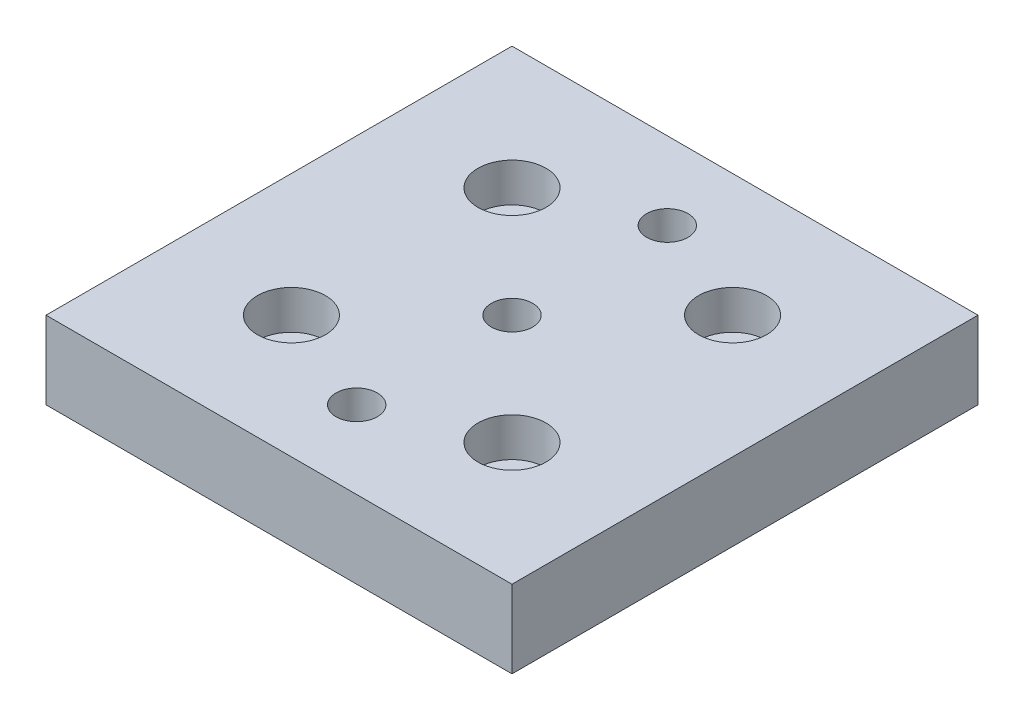
ISO-10303-21;
HEADER;
FILE_DESCRIPTION(('STEP AP214'),'2;1');
FILE_NAME('part.step','',(''),(''),'','','');
FILE_SCHEMA(('AUTOMOTIVE_DESIGN { 1 0 10303 214 1 1 1 1 }'));
ENDSEC;
DATA;
#1=APPLICATION_CONTEXT('core data for automotive mechanical design processes');
#2=APPLICATION_PROTOCOL_DEFINITION('international standard','automotive_design',2000,#1);
#3=PRODUCT_CONTEXT('',#1,'mechanical');
#4=PRODUCT('Part','Part','',(#3));
#5=PRODUCT_RELATED_PRODUCT_CATEGORY('part','',(#4));
#6=PRODUCT_DEFINITION_FORMATION('','',#4);
#7=PRODUCT_DEFINITION_CONTEXT('part definition',#1,'design');
#8=PRODUCT_DEFINITION('design','',#6,#7);
#9=PRODUCT_DEFINITION_SHAPE('','',#8);
#10=(LENGTH_UNIT() NAMED_UNIT(*) SI_UNIT(.MILLI.,.METRE.));
#11=(NAMED_UNIT(*) PLANE_ANGLE_UNIT() SI_UNIT($,.RADIAN.));
#12=(NAMED_UNIT(*) SI_UNIT($,.STERADIAN.) SOLID_ANGLE_UNIT());
#13=UNCERTAINTY_MEASURE_WITH_UNIT(LENGTH_MEASURE(1.E-05),#10,'distance_accuracy_value','');
#14=(GEOMETRIC_REPRESENTATION_CONTEXT(3) GLOBAL_UNCERTAINTY_ASSIGNED_CONTEXT((#13)) GLOBAL_UNIT_ASSIGNED_CONTEXT((#10,
#11,#12)) REPRESENTATION_CONTEXT('',''));
#15=CARTESIAN_POINT('',(0.,0.,0.));
#16=DIRECTION('',(0.,0.,1.));
#17=DIRECTION('',(1.,0.,0.));
#18=AXIS2_PLACEMENT_3D('',#15,#16,#17);
#19=CARTESIAN_POINT('',(38.1,12.7,38.1));
#20=DIRECTION('',(-1.,0.,0.));
#21=DIRECTION('',(0.,0.,1.));
#22=AXIS2_PLACEMENT_3D('',#19,#20,#21);
#23=PLANE('',#22);
#24=DIRECTION('',(0.,0.,-1.));
#25=VECTOR('',#24,1.);
#26=CARTESIAN_POINT('',(38.1,0.,38.1));
#27=LINE('',#26,#25);
#28=CARTESIAN_POINT('',(38.1,0.,38.1));
#29=VERTEX_POINT('',#28);
#30=CARTESIAN_POINT('',(38.1,0.,-38.1));
#31=VERTEX_POINT('',#30);
#32=EDGE_CURVE('E95',#29,#31,#27,.T.);
#33=ORIENTED_EDGE('',*,*,#32,.T.);
#34=DIRECTION('',(0.,-1.,0.));
#35=VECTOR('',#34,1.);
#36=CARTESIAN_POINT('',(38.1,12.7,-38.1));
#37=LINE('',#36,#35);
#38=CARTESIAN_POINT('',(38.1,12.7,-38.1));
#39=VERTEX_POINT('',#38);
#40=EDGE_CURVE('E11',#39,#31,#37,.T.);
#41=ORIENTED_EDGE('',*,*,#40,.F.);
#42=DIRECTION('',(0.,0.,-1.));
#43=VECTOR('',#42,1.);
#44=CARTESIAN_POINT('',(38.1,12.7,38.1));
#45=LINE('',#44,#43);
#46=CARTESIAN_POINT('',(38.1,12.7,38.1));
#47=VERTEX_POINT('',#46);
#48=EDGE_CURVE('E83',#47,#39,#45,.T.);
#49=ORIENTED_EDGE('',*,*,#48,.F.);
#50=DIRECTION('',(0.,-1.,0.));
#51=VECTOR('',#50,1.);
#52=CARTESIAN_POINT('',(38.1,12.7,38.1));
#53=LINE('',#52,#51);
#54=EDGE_CURVE('E91',#47,#29,#53,.T.);
#55=ORIENTED_EDGE('',*,*,#54,.T.);
#56=EDGE_LOOP('',(#33,#41,#49,#55));
#57=FACE_BOUND('',#56,.T.);
#58=ADVANCED_FACE('F32',(#57),#23,.F.);
#59=CARTESIAN_POINT('',(-38.1,12.7,-38.1));
#60=DIRECTION('',(0.,0.,1.));
#61=DIRECTION('',(1.,0.,0.));
#62=AXIS2_PLACEMENT_3D('',#59,#60,#61);
#63=PLANE('',#62);
#64=DIRECTION('',(-1.,0.,0.));
#65=VECTOR('',#64,1.);
#66=CARTESIAN_POINT('',(-38.1,0.,-38.1));
#67=LINE('',#66,#65);
#68=CARTESIAN_POINT('',(-38.1,0.,-38.1));
#69=VERTEX_POINT('',#68);
#70=EDGE_CURVE('E87',#31,#69,#67,.T.);
#71=ORIENTED_EDGE('',*,*,#70,.T.);
#72=DIRECTION('',(0.,-1.,0.));
#73=VECTOR('',#72,1.);
#74=CARTESIAN_POINT('',(-38.1,12.7,-38.1));
#75=LINE('',#74,#73);
#76=CARTESIAN_POINT('',(-38.1,12.7,-38.1));
#77=VERTEX_POINT('',#76);
#78=EDGE_CURVE('E40',#77,#69,#75,.T.);
#79=ORIENTED_EDGE('',*,*,#78,.F.);
#80=DIRECTION('',(-1.,0.,0.));
#81=VECTOR('',#80,1.);
#82=CARTESIAN_POINT('',(-38.1,12.7,-38.1));
#83=LINE('',#82,#81);
#84=EDGE_CURVE('E78',#39,#77,#83,.T.);
#85=ORIENTED_EDGE('',*,*,#84,.F.);
#86=ORIENTED_EDGE('',*,*,#40,.T.);
#87=EDGE_LOOP('',(#71,#79,#85,#86));
#88=FACE_BOUND('',#87,.T.);
#89=ADVANCED_FACE('F86',(#88),#63,.F.);
#90=CARTESIAN_POINT('',(-38.1,12.7,38.1));
#91=DIRECTION('',(1.,0.,0.));
#92=DIRECTION('',(0.,0.,-1.));
#93=AXIS2_PLACEMENT_3D('',#90,#91,#92);
#94=PLANE('',#93);
#95=DIRECTION('',(0.,0.,1.));
#96=VECTOR('',#95,1.);
#97=CARTESIAN_POINT('',(-38.1,0.,38.1));
#98=LINE('',#97,#96);
#99=CARTESIAN_POINT('',(-38.1,0.,38.1));
#100=VERTEX_POINT('',#99);
#101=EDGE_CURVE('E65',#69,#100,#98,.T.);
#102=ORIENTED_EDGE('',*,*,#101,.T.);
#103=DIRECTION('',(0.,-1.,0.));
#104=VECTOR('',#103,1.);
#105=CARTESIAN_POINT('',(-38.1,12.7,38.1));
#106=LINE('',#105,#104);
#107=CARTESIAN_POINT('',(-38.1,12.7,38.1));
#108=VERTEX_POINT('',#107);
#109=EDGE_CURVE('E88',#108,#100,#106,.T.);
#110=ORIENTED_EDGE('',*,*,#109,.F.);
#111=DIRECTION('',(0.,0.,1.));
#112=VECTOR('',#111,1.);
#113=CARTESIAN_POINT('',(-38.1,12.7,38.1));
#114=LINE('',#113,#112);
#115=EDGE_CURVE('E81',#77,#108,#114,.T.);
#116=ORIENTED_EDGE('',*,*,#115,.F.);
#117=ORIENTED_EDGE('',*,*,#78,.T.);
#118=EDGE_LOOP('',(#102,#110,#116,#117));
#119=FACE_BOUND('',#118,.T.);
#120=ADVANCED_FACE('F89',(#119),#94,.F.);
#121=CARTESIAN_POINT('',(-38.1,12.7,38.1));
#122=DIRECTION('',(0.,0.,-1.));
#123=DIRECTION('',(-1.,0.,0.));
#124=AXIS2_PLACEMENT_3D('',#121,#122,#123);
#125=PLANE('',#124);
#126=DIRECTION('',(1.,0.,0.));
#127=VECTOR('',#126,1.);
#128=CARTESIAN_POINT('',(-38.1,0.,38.1));
#129=LINE('',#128,#127);
#130=EDGE_CURVE('E71',#100,#29,#129,.T.);
#131=ORIENTED_EDGE('',*,*,#130,.T.);
#132=ORIENTED_EDGE('',*,*,#54,.F.);
#133=DIRECTION('',(1.,0.,0.));
#134=VECTOR('',#133,1.);
#135=CARTESIAN_POINT('',(-38.1,12.7,38.1));
#136=LINE('',#135,#134);
#137=EDGE_CURVE('E48',#108,#47,#136,.T.);
#138=ORIENTED_EDGE('',*,*,#137,.F.);
#139=ORIENTED_EDGE('',*,*,#109,.T.);
#140=EDGE_LOOP('',(#131,#132,#138,#139));
#141=FACE_BOUND('',#140,.T.);
#142=ADVANCED_FACE('F103',(#141),#125,.F.);
#143=CARTESIAN_POINT('',(0.,12.7,0.));
#144=DIRECTION('',(0.,-1.,0.));
#145=DIRECTION('',(0.,0.,-1.));
#146=AXIS2_PLACEMENT_3D('',#143,#144,#145);
#147=PLANE('',#146);
#148=CARTESIAN_POINT('',(0.,12.7,-25.4));
#149=DIRECTION('',(0.,-1.,0.));
#150=DIRECTION('',(0.,0.,-1.));
#151=AXIS2_PLACEMENT_3D('',#148,#149,#150);
#152=CIRCLE('',#151,3.3782);
#153=CARTESIAN_POINT('',(0.,12.7,-28.7782));
#154=VERTEX_POINT('',#153);
#155=EDGE_CURVE('E180',#154,#154,#152,.T.);
#156=ORIENTED_EDGE('',*,*,#155,.T.);
#157=EDGE_LOOP('',(#156));
#158=FACE_BOUND('',#157,.T.);
#159=CARTESIAN_POINT('',(0.,12.7,0.));
#160=DIRECTION('',(0.,-1.,0.));
#161=DIRECTION('',(0.,0.,-1.));
#162=AXIS2_PLACEMENT_3D('',#159,#160,#161);
#163=CIRCLE('',#162,3.3782);
#164=CARTESIAN_POINT('',(0.,12.7,-3.3782));
#165=VERTEX_POINT('',#164);
#166=EDGE_CURVE('E168',#165,#165,#163,.T.);
#167=ORIENTED_EDGE('',*,*,#166,.T.);
#168=EDGE_LOOP('',(#167));
#169=FACE_BOUND('',#168,.T.);
#170=CARTESIAN_POINT('',(0.,12.7,25.4));
#171=DIRECTION('',(0.,-1.,0.));
#172=DIRECTION('',(0.,0.,-1.));
#173=AXIS2_PLACEMENT_3D('',#170,#171,#172);
#174=CIRCLE('',#173,3.3782);
#175=CARTESIAN_POINT('',(0.,12.7,22.0218));
#176=VERTEX_POINT('',#175);
#177=EDGE_CURVE('E156',#176,#176,#174,.T.);
#178=ORIENTED_EDGE('',*,*,#177,.T.);
#179=EDGE_LOOP('',(#178));
#180=FACE_BOUND('',#179,.T.);
#181=CARTESIAN_POINT('',(-18.034,12.7,-18.034));
#182=DIRECTION('',(0.,1.,0.));
#183=DIRECTION('',(0.,0.,1.));
#184=AXIS2_PLACEMENT_3D('',#181,#182,#183);
#185=CIRCLE('',#184,5.55625);
#186=CARTESIAN_POINT('',(-18.034,12.7,-12.47775));
#187=VERTEX_POINT('',#186);
#188=EDGE_CURVE('E153',#187,#187,#185,.T.);
#189=ORIENTED_EDGE('',*,*,#188,.F.);
#190=EDGE_LOOP('',(#189));
#191=FACE_BOUND('',#190,.T.);
#192=CARTESIAN_POINT('',(18.034,12.7,-18.034));
#193=DIRECTION('',(0.,1.,0.));
#194=DIRECTION('',(0.,0.,1.));
#195=AXIS2_PLACEMENT_3D('',#192,#193,#194);
#196=CIRCLE('',#195,5.55625);
#197=CARTESIAN_POINT('',(18.034,12.7,-12.47775));
#198=VERTEX_POINT('',#197);
#199=EDGE_CURVE('E141',#198,#198,#196,.T.);
#200=ORIENTED_EDGE('',*,*,#199,.F.);
#201=EDGE_LOOP('',(#200));
#202=FACE_BOUND('',#201,.T.);
#203=CARTESIAN_POINT('',(18.034,12.7,18.034));
#204=DIRECTION('',(0.,1.,0.));
#205=DIRECTION('',(0.,0.,1.));
#206=AXIS2_PLACEMENT_3D('',#203,#204,#205);
#207=CIRCLE('',#206,5.55625);
#208=CARTESIAN_POINT('',(18.034,12.7,23.59025));
#209=VERTEX_POINT('',#208);
#210=EDGE_CURVE('E129',#209,#209,#207,.T.);
#211=ORIENTED_EDGE('',*,*,#210,.F.);
#212=EDGE_LOOP('',(#211));
#213=FACE_BOUND('',#212,.T.);
#214=CARTESIAN_POINT('',(-18.034,12.7,18.034));
#215=DIRECTION('',(0.,1.,0.));
#216=DIRECTION('',(0.,0.,1.));
#217=AXIS2_PLACEMENT_3D('',#214,#215,#216);
#218=CIRCLE('',#217,5.55625);
#219=CARTESIAN_POINT('',(-18.034,12.7,23.59025));
#220=VERTEX_POINT('',#219);
#221=EDGE_CURVE('E117',#220,#220,#218,.T.);
#222=ORIENTED_EDGE('',*,*,#221,.F.);
#223=EDGE_LOOP('',(#222));
#224=FACE_BOUND('',#223,.T.);
#225=ORIENTED_EDGE('',*,*,#48,.T.);
#226=ORIENTED_EDGE('',*,*,#84,.T.);
#227=ORIENTED_EDGE('',*,*,#115,.T.);
#228=ORIENTED_EDGE('',*,*,#137,.T.);
#229=EDGE_LOOP('',(#225,#226,#227,#228));
#230=FACE_BOUND('',#229,.T.);
#231=ADVANCED_FACE('F79',(#158,#169,#180,#191,#202,#213,#224,#230),#147,.F.);
#232=CARTESIAN_POINT('',(0.,0.,0.));
#233=DIRECTION('',(0.,-1.,0.));
#234=DIRECTION('',(0.,0.,-1.));
#235=AXIS2_PLACEMENT_3D('',#232,#233,#234);
#236=PLANE('',#235);
#237=CARTESIAN_POINT('',(0.,0.,-25.4));
#238=DIRECTION('',(0.,-1.,0.));
#239=DIRECTION('',(0.,0.,-1.));
#240=AXIS2_PLACEMENT_3D('',#237,#238,#239);
#241=CIRCLE('',#240,5.55625);
#242=CARTESIAN_POINT('',(0.,0.,-30.95625));
#243=VERTEX_POINT('',#242);
#244=EDGE_CURVE('E189',#243,#243,#241,.T.);
#245=ORIENTED_EDGE('',*,*,#244,.F.);
#246=EDGE_LOOP('',(#245));
#247=FACE_BOUND('',#246,.T.);
#248=CARTESIAN_POINT('',(0.,0.,0.));
#249=DIRECTION('',(0.,-1.,0.));
#250=DIRECTION('',(0.,0.,-1.));
#251=AXIS2_PLACEMENT_3D('',#248,#249,#250);
#252=CIRCLE('',#251,5.55625);
#253=CARTESIAN_POINT('',(0.,0.,-5.55625));
#254=VERTEX_POINT('',#253);
#255=EDGE_CURVE('E177',#254,#254,#252,.T.);
#256=ORIENTED_EDGE('',*,*,#255,.F.);
#257=EDGE_LOOP('',(#256));
#258=FACE_BOUND('',#257,.T.);
#259=CARTESIAN_POINT('',(0.,0.,25.4));
#260=DIRECTION('',(0.,-1.,0.));
#261=DIRECTION('',(0.,0.,-1.));
#262=AXIS2_PLACEMENT_3D('',#259,#260,#261);
#263=CIRCLE('',#262,5.55625);
#264=CARTESIAN_POINT('',(0.,0.,19.84375));
#265=VERTEX_POINT('',#264);
#266=EDGE_CURVE('E165',#265,#265,#263,.T.);
#267=ORIENTED_EDGE('',*,*,#266,.F.);
#268=EDGE_LOOP('',(#267));
#269=FACE_BOUND('',#268,.T.);
#270=CARTESIAN_POINT('',(-18.034,0.,-18.034));
#271=DIRECTION('',(0.,1.,0.));
#272=DIRECTION('',(0.,0.,1.));
#273=AXIS2_PLACEMENT_3D('',#270,#271,#272);
#274=CIRCLE('',#273,3.3782);
#275=CARTESIAN_POINT('',(-18.034,0.,-14.6558));
#276=VERTEX_POINT('',#275);
#277=EDGE_CURVE('E144',#276,#276,#274,.T.);
#278=ORIENTED_EDGE('',*,*,#277,.T.);
#279=EDGE_LOOP('',(#278));
#280=FACE_BOUND('',#279,.T.);
#281=CARTESIAN_POINT('',(18.034,0.,-18.034));
#282=DIRECTION('',(0.,1.,0.));
#283=DIRECTION('',(0.,0.,1.));
#284=AXIS2_PLACEMENT_3D('',#281,#282,#283);
#285=CIRCLE('',#284,3.3782);
#286=CARTESIAN_POINT('',(18.034,0.,-14.6558));
#287=VERTEX_POINT('',#286);
#288=EDGE_CURVE('E132',#287,#287,#285,.T.);
#289=ORIENTED_EDGE('',*,*,#288,.T.);
#290=EDGE_LOOP('',(#289));
#291=FACE_BOUND('',#290,.T.);
#292=CARTESIAN_POINT('',(18.034,0.,18.034));
#293=DIRECTION('',(0.,1.,0.));
#294=DIRECTION('',(0.,0.,1.));
#295=AXIS2_PLACEMENT_3D('',#292,#293,#294);
#296=CIRCLE('',#295,3.3782);
#297=CARTESIAN_POINT('',(18.034,0.,21.4122));
#298=VERTEX_POINT('',#297);
#299=EDGE_CURVE('E120',#298,#298,#296,.T.);
#300=ORIENTED_EDGE('',*,*,#299,.T.);
#301=EDGE_LOOP('',(#300));
#302=FACE_BOUND('',#301,.T.);
#303=CARTESIAN_POINT('',(-18.034,0.,18.034));
#304=DIRECTION('',(0.,1.,0.));
#305=DIRECTION('',(0.,0.,1.));
#306=AXIS2_PLACEMENT_3D('',#303,#304,#305);
#307=CIRCLE('',#306,3.3782);
#308=CARTESIAN_POINT('',(-18.034,0.,21.4122));
#309=VERTEX_POINT('',#308);
#310=EDGE_CURVE('E98',#309,#309,#307,.T.);
#311=ORIENTED_EDGE('',*,*,#310,.T.);
#312=EDGE_LOOP('',(#311));
#313=FACE_BOUND('',#312,.T.);
#314=ORIENTED_EDGE('',*,*,#32,.F.);
#315=ORIENTED_EDGE('',*,*,#130,.F.);
#316=ORIENTED_EDGE('',*,*,#101,.F.);
#317=ORIENTED_EDGE('',*,*,#70,.F.);
#318=EDGE_LOOP('',(#314,#315,#316,#317));
#319=FACE_BOUND('',#318,.T.);
#320=ADVANCED_FACE('F106',(#247,#258,#269,#280,#291,#302,#313,#319),#236,.T.);
#321=CARTESIAN_POINT('',(-18.034,12.7,18.034));
#322=DIRECTION('',(0.,1.,0.));
#323=DIRECTION('',(0.,0.,1.));
#324=AXIS2_PLACEMENT_3D('',#321,#322,#323);
#325=CYLINDRICAL_SURFACE('',#324,3.3782);
#326=ORIENTED_EDGE('',*,*,#310,.F.);
#327=EDGE_LOOP('',(#326));
#328=FACE_BOUND('',#327,.T.);
#329=CARTESIAN_POINT('',(-18.034,6.35,18.034));
#330=DIRECTION('',(0.,1.,0.));
#331=DIRECTION('',(0.,0.,1.));
#332=AXIS2_PLACEMENT_3D('',#329,#330,#331);
#333=CIRCLE('',#332,3.3782);
#334=CARTESIAN_POINT('',(-18.034,6.35,21.4122));
#335=VERTEX_POINT('',#334);
#336=EDGE_CURVE('E111',#335,#335,#333,.T.);
#337=ORIENTED_EDGE('',*,*,#336,.T.);
#338=EDGE_LOOP('',(#337));
#339=FACE_BOUND('',#338,.T.);
#340=ADVANCED_FACE('F197',(#328,#339),#325,.F.);
#341=CARTESIAN_POINT('',(-14.6558,6.35,18.034));
#342=DIRECTION('',(0.,-1.,0.));
#343=DIRECTION('',(0.,0.,-1.));
#344=AXIS2_PLACEMENT_3D('',#341,#342,#343);
#345=PLANE('',#344);
#346=ORIENTED_EDGE('',*,*,#336,.F.);
#347=EDGE_LOOP('',(#346));
#348=FACE_BOUND('',#347,.T.);
#349=CARTESIAN_POINT('',(-18.034,6.35,18.034));
#350=DIRECTION('',(0.,1.,0.));
#351=DIRECTION('',(0.,0.,1.));
#352=AXIS2_PLACEMENT_3D('',#349,#350,#351);
#353=CIRCLE('',#352,5.55625);
#354=CARTESIAN_POINT('',(-18.034,6.35,23.59025));
#355=VERTEX_POINT('',#354);
#356=EDGE_CURVE('E114',#355,#355,#353,.T.);
#357=ORIENTED_EDGE('',*,*,#356,.T.);
#358=EDGE_LOOP('',(#357));
#359=FACE_BOUND('',#358,.T.);
#360=ADVANCED_FACE('F213',(#348,#359),#345,.F.);
#361=CARTESIAN_POINT('',(-18.034,12.7,18.034));
#362=DIRECTION('',(0.,1.,0.));
#363=DIRECTION('',(0.,0.,1.));
#364=AXIS2_PLACEMENT_3D('',#361,#362,#363);
#365=CYLINDRICAL_SURFACE('',#364,5.55625);
#366=ORIENTED_EDGE('',*,*,#356,.F.);
#367=EDGE_LOOP('',(#366));
#368=FACE_BOUND('',#367,.T.);
#369=ORIENTED_EDGE('',*,*,#221,.T.);
#370=EDGE_LOOP('',(#369));
#371=FACE_BOUND('',#370,.T.);
#372=ADVANCED_FACE('F219',(#368,#371),#365,.F.);
#373=CARTESIAN_POINT('',(18.034,12.7,18.034));
#374=DIRECTION('',(0.,1.,0.));
#375=DIRECTION('',(0.,0.,1.));
#376=AXIS2_PLACEMENT_3D('',#373,#374,#375);
#377=CYLINDRICAL_SURFACE('',#376,3.3782);
#378=ORIENTED_EDGE('',*,*,#299,.F.);
#379=EDGE_LOOP('',(#378));
#380=FACE_BOUND('',#379,.T.);
#381=CARTESIAN_POINT('',(18.034,6.35,18.034));
#382=DIRECTION('',(0.,1.,0.));
#383=DIRECTION('',(0.,0.,1.));
#384=AXIS2_PLACEMENT_3D('',#381,#382,#383);
#385=CIRCLE('',#384,3.3782);
#386=CARTESIAN_POINT('',(18.034,6.35,21.4122));
#387=VERTEX_POINT('',#386);
#388=EDGE_CURVE('E123',#387,#387,#385,.T.);
#389=ORIENTED_EDGE('',*,*,#388,.T.);
#390=EDGE_LOOP('',(#389));
#391=FACE_BOUND('',#390,.T.);
#392=ADVANCED_FACE('F225',(#380,#391),#377,.F.);
#393=CARTESIAN_POINT('',(21.4122,6.35,18.034));
#394=DIRECTION('',(0.,-1.,0.));
#395=DIRECTION('',(0.,0.,-1.));
#396=AXIS2_PLACEMENT_3D('',#393,#394,#395);
#397=PLANE('',#396);
#398=ORIENTED_EDGE('',*,*,#388,.F.);
#399=EDGE_LOOP('',(#398));
#400=FACE_BOUND('',#399,.T.);
#401=CARTESIAN_POINT('',(18.034,6.35,18.034));
#402=DIRECTION('',(0.,1.,0.));
#403=DIRECTION('',(0.,0.,1.));
#404=AXIS2_PLACEMENT_3D('',#401,#402,#403);
#405=CIRCLE('',#404,5.55625);
#406=CARTESIAN_POINT('',(18.034,6.35,23.59025));
#407=VERTEX_POINT('',#406);
#408=EDGE_CURVE('E126',#407,#407,#405,.T.);
#409=ORIENTED_EDGE('',*,*,#408,.T.);
#410=EDGE_LOOP('',(#409));
#411=FACE_BOUND('',#410,.T.);
#412=ADVANCED_FACE('F280',(#400,#411),#397,.F.);
#413=CARTESIAN_POINT('',(18.034,12.7,18.034));
#414=DIRECTION('',(0.,1.,0.));
#415=DIRECTION('',(0.,0.,1.));
#416=AXIS2_PLACEMENT_3D('',#413,#414,#415);
#417=CYLINDRICAL_SURFACE('',#416,5.55625);
#418=ORIENTED_EDGE('',*,*,#408,.F.);
#419=EDGE_LOOP('',(#418));
#420=FACE_BOUND('',#419,.T.);
#421=ORIENTED_EDGE('',*,*,#210,.T.);
#422=EDGE_LOOP('',(#421));
#423=FACE_BOUND('',#422,.T.);
#424=ADVANCED_FACE('F290',(#420,#423),#417,.F.);
#425=CARTESIAN_POINT('',(18.034,12.7,-18.034));
#426=DIRECTION('',(0.,1.,0.));
#427=DIRECTION('',(0.,0.,1.));
#428=AXIS2_PLACEMENT_3D('',#425,#426,#427);
#429=CYLINDRICAL_SURFACE('',#428,3.3782);
#430=ORIENTED_EDGE('',*,*,#288,.F.);
#431=EDGE_LOOP('',(#430));
#432=FACE_BOUND('',#431,.T.);
#433=CARTESIAN_POINT('',(18.034,6.35,-18.034));
#434=DIRECTION('',(0.,1.,0.));
#435=DIRECTION('',(0.,0.,1.));
#436=AXIS2_PLACEMENT_3D('',#433,#434,#435);
#437=CIRCLE('',#436,3.3782);
#438=CARTESIAN_POINT('',(18.034,6.35,-14.6558));
#439=VERTEX_POINT('',#438);
#440=EDGE_CURVE('E135',#439,#439,#437,.T.);
#441=ORIENTED_EDGE('',*,*,#440,.T.);
#442=EDGE_LOOP('',(#441));
#443=FACE_BOUND('',#442,.T.);
#444=ADVANCED_FACE('F300',(#432,#443),#429,.F.);
#445=CARTESIAN_POINT('',(21.4122,6.35,-18.034));
#446=DIRECTION('',(0.,-1.,0.));
#447=DIRECTION('',(0.,0.,-1.));
#448=AXIS2_PLACEMENT_3D('',#445,#446,#447);
#449=PLANE('',#448);
#450=ORIENTED_EDGE('',*,*,#440,.F.);
#451=EDGE_LOOP('',(#450));
#452=FACE_BOUND('',#451,.T.);
#453=CARTESIAN_POINT('',(18.034,6.35,-18.034));
#454=DIRECTION('',(0.,1.,0.));
#455=DIRECTION('',(0.,0.,1.));
#456=AXIS2_PLACEMENT_3D('',#453,#454,#455);
#457=CIRCLE('',#456,5.55625);
#458=CARTESIAN_POINT('',(18.034,6.35,-12.47775));
#459=VERTEX_POINT('',#458);
#460=EDGE_CURVE('E138',#459,#459,#457,.T.);
#461=ORIENTED_EDGE('',*,*,#460,.T.);
#462=EDGE_LOOP('',(#461));
#463=FACE_BOUND('',#462,.T.);
#464=ADVANCED_FACE('F310',(#452,#463),#449,.F.);
#465=CARTESIAN_POINT('',(18.034,12.7,-18.034));
#466=DIRECTION('',(0.,1.,0.));
#467=DIRECTION('',(0.,0.,1.));
#468=AXIS2_PLACEMENT_3D('',#465,#466,#467);
#469=CYLINDRICAL_SURFACE('',#468,5.55625);
#470=ORIENTED_EDGE('',*,*,#460,.F.);
#471=EDGE_LOOP('',(#470));
#472=FACE_BOUND('',#471,.T.);
#473=ORIENTED_EDGE('',*,*,#199,.T.);
#474=EDGE_LOOP('',(#473));
#475=FACE_BOUND('',#474,.T.);
#476=ADVANCED_FACE('F320',(#472,#475),#469,.F.);
#477=CARTESIAN_POINT('',(-18.034,12.7,-18.034));
#478=DIRECTION('',(0.,1.,0.));
#479=DIRECTION('',(0.,0.,1.));
#480=AXIS2_PLACEMENT_3D('',#477,#478,#479);
#481=CYLINDRICAL_SURFACE('',#480,3.3782);
#482=ORIENTED_EDGE('',*,*,#277,.F.);
#483=EDGE_LOOP('',(#482));
#484=FACE_BOUND('',#483,.T.);
#485=CARTESIAN_POINT('',(-18.034,6.35,-18.034));
#486=DIRECTION('',(0.,1.,0.));
#487=DIRECTION('',(0.,0.,1.));
#488=AXIS2_PLACEMENT_3D('',#485,#486,#487);
#489=CIRCLE('',#488,3.3782);
#490=CARTESIAN_POINT('',(-18.034,6.35,-14.6558));
#491=VERTEX_POINT('',#490);
#492=EDGE_CURVE('E147',#491,#491,#489,.T.);
#493=ORIENTED_EDGE('',*,*,#492,.T.);
#494=EDGE_LOOP('',(#493));
#495=FACE_BOUND('',#494,.T.);
#496=ADVANCED_FACE('F330',(#484,#495),#481,.F.);
#497=CARTESIAN_POINT('',(-14.6558,6.35,-18.034));
#498=DIRECTION('',(0.,-1.,0.));
#499=DIRECTION('',(0.,0.,-1.));
#500=AXIS2_PLACEMENT_3D('',#497,#498,#499);
#501=PLANE('',#500);
#502=ORIENTED_EDGE('',*,*,#492,.F.);
#503=EDGE_LOOP('',(#502));
#504=FACE_BOUND('',#503,.T.);
#505=CARTESIAN_POINT('',(-18.034,6.35,-18.034));
#506=DIRECTION('',(0.,1.,0.));
#507=DIRECTION('',(0.,0.,1.));
#508=AXIS2_PLACEMENT_3D('',#505,#506,#507);
#509=CIRCLE('',#508,5.55625);
#510=CARTESIAN_POINT('',(-18.034,6.35,-12.47775));
#511=VERTEX_POINT('',#510);
#512=EDGE_CURVE('E150',#511,#511,#509,.T.);
#513=ORIENTED_EDGE('',*,*,#512,.T.);
#514=EDGE_LOOP('',(#513));
#515=FACE_BOUND('',#514,.T.);
#516=ADVANCED_FACE('F340',(#504,#515),#501,.F.);
#517=CARTESIAN_POINT('',(-18.034,12.7,-18.034));
#518=DIRECTION('',(0.,1.,0.));
#519=DIRECTION('',(0.,0.,1.));
#520=AXIS2_PLACEMENT_3D('',#517,#518,#519);
#521=CYLINDRICAL_SURFACE('',#520,5.55625);
#522=ORIENTED_EDGE('',*,*,#512,.F.);
#523=EDGE_LOOP('',(#522));
#524=FACE_BOUND('',#523,.T.);
#525=ORIENTED_EDGE('',*,*,#188,.T.);
#526=EDGE_LOOP('',(#525));
#527=FACE_BOUND('',#526,.T.);
#528=ADVANCED_FACE('F350',(#524,#527),#521,.F.);
#529=CARTESIAN_POINT('',(0.,0.,25.4));
#530=DIRECTION('',(0.,-1.,0.));
#531=DIRECTION('',(0.,0.,-1.));
#532=AXIS2_PLACEMENT_3D('',#529,#530,#531);
#533=CYLINDRICAL_SURFACE('',#532,3.3782);
#534=ORIENTED_EDGE('',*,*,#177,.F.);
#535=EDGE_LOOP('',(#534));
#536=FACE_BOUND('',#535,.T.);
#537=CARTESIAN_POINT('',(0.,6.35,25.4));
#538=DIRECTION('',(0.,-1.,0.));
#539=DIRECTION('',(0.,0.,-1.));
#540=AXIS2_PLACEMENT_3D('',#537,#538,#539);
#541=CIRCLE('',#540,3.3782);
#542=CARTESIAN_POINT('',(0.,6.35,22.0218));
#543=VERTEX_POINT('',#542);
#544=EDGE_CURVE('E159',#543,#543,#541,.T.);
#545=ORIENTED_EDGE('',*,*,#544,.T.);
#546=EDGE_LOOP('',(#545));
#547=FACE_BOUND('',#546,.T.);
#548=ADVANCED_FACE('F359',(#536,#547),#533,.F.);
#549=CARTESIAN_POINT('',(3.3782,6.35,25.4));
#550=DIRECTION('',(0.,1.,0.));
#551=DIRECTION('',(0.,0.,1.));
#552=AXIS2_PLACEMENT_3D('',#549,#550,#551);
#553=PLANE('',#552);
#554=ORIENTED_EDGE('',*,*,#544,.F.);
#555=EDGE_LOOP('',(#554));
#556=FACE_BOUND('',#555,.T.);
#557=CARTESIAN_POINT('',(0.,6.35,25.4));
#558=DIRECTION('',(0.,-1.,0.));
#559=DIRECTION('',(0.,0.,-1.));
#560=AXIS2_PLACEMENT_3D('',#557,#558,#559);
#561=CIRCLE('',#560,5.55625);
#562=CARTESIAN_POINT('',(0.,6.35,19.84375));
#563=VERTEX_POINT('',#562);
#564=EDGE_CURVE('E162',#563,#563,#561,.T.);
#565=ORIENTED_EDGE('',*,*,#564,.T.);
#566=EDGE_LOOP('',(#565));
#567=FACE_BOUND('',#566,.T.);
#568=ADVANCED_FACE('F378',(#556,#567),#553,.F.);
#569=CARTESIAN_POINT('',(0.,0.,25.4));
#570=DIRECTION('',(0.,-1.,0.));
#571=DIRECTION('',(0.,0.,-1.));
#572=AXIS2_PLACEMENT_3D('',#569,#570,#571);
#573=CYLINDRICAL_SURFACE('',#572,5.55625);
#574=ORIENTED_EDGE('',*,*,#564,.F.);
#575=EDGE_LOOP('',(#574));
#576=FACE_BOUND('',#575,.T.);
#577=ORIENTED_EDGE('',*,*,#266,.T.);
#578=EDGE_LOOP('',(#577));
#579=FACE_BOUND('',#578,.T.);
#580=ADVANCED_FACE('F388',(#576,#579),#573,.F.);
#581=CARTESIAN_POINT('',(0.,0.,0.));
#582=DIRECTION('',(0.,-1.,0.));
#583=DIRECTION('',(0.,0.,-1.));
#584=AXIS2_PLACEMENT_3D('',#581,#582,#583);
#585=CYLINDRICAL_SURFACE('',#584,3.3782);
#586=ORIENTED_EDGE('',*,*,#166,.F.);
#587=EDGE_LOOP('',(#586));
#588=FACE_BOUND('',#587,.T.);
#589=CARTESIAN_POINT('',(0.,6.35,0.));
#590=DIRECTION('',(0.,-1.,0.));
#591=DIRECTION('',(0.,0.,-1.));
#592=AXIS2_PLACEMENT_3D('',#589,#590,#591);
#593=CIRCLE('',#592,3.3782);
#594=CARTESIAN_POINT('',(0.,6.35,-3.3782));
#595=VERTEX_POINT('',#594);
#596=EDGE_CURVE('E171',#595,#595,#593,.T.);
#597=ORIENTED_EDGE('',*,*,#596,.T.);
#598=EDGE_LOOP('',(#597));
#599=FACE_BOUND('',#598,.T.);
#600=ADVANCED_FACE('F398',(#588,#599),#585,.F.);
#601=CARTESIAN_POINT('',(3.3782,6.35,0.));
#602=DIRECTION('',(0.,1.,0.));
#603=DIRECTION('',(0.,0.,1.));
#604=AXIS2_PLACEMENT_3D('',#601,#602,#603);
#605=PLANE('',#604);
#606=ORIENTED_EDGE('',*,*,#596,.F.);
#607=EDGE_LOOP('',(#606));
#608=FACE_BOUND('',#607,.T.);
#609=CARTESIAN_POINT('',(0.,6.35,0.));
#610=DIRECTION('',(0.,-1.,0.));
#611=DIRECTION('',(0.,0.,-1.));
#612=AXIS2_PLACEMENT_3D('',#609,#610,#611);
#613=CIRCLE('',#612,5.55625);
#614=CARTESIAN_POINT('',(0.,6.35,-5.55625));
#615=VERTEX_POINT('',#614);
#616=EDGE_CURVE('E174',#615,#615,#613,.T.);
#617=ORIENTED_EDGE('',*,*,#616,.T.);
#618=EDGE_LOOP('',(#617));
#619=FACE_BOUND('',#618,.T.);
#620=ADVANCED_FACE('F408',(#608,#619),#605,.F.);
#621=CARTESIAN_POINT('',(0.,0.,0.));
#622=DIRECTION('',(0.,-1.,0.));
#623=DIRECTION('',(0.,0.,-1.));
#624=AXIS2_PLACEMENT_3D('',#621,#622,#623);
#625=CYLINDRICAL_SURFACE('',#624,5.55625);
#626=ORIENTED_EDGE('',*,*,#616,.F.);
#627=EDGE_LOOP('',(#626));
#628=FACE_BOUND('',#627,.T.);
#629=ORIENTED_EDGE('',*,*,#255,.T.);
#630=EDGE_LOOP('',(#629));
#631=FACE_BOUND('',#630,.T.);
#632=ADVANCED_FACE('F418',(#628,#631),#625,.F.);
#633=CARTESIAN_POINT('',(0.,0.,-25.4));
#634=DIRECTION('',(0.,-1.,0.));
#635=DIRECTION('',(0.,0.,-1.));
#636=AXIS2_PLACEMENT_3D('',#633,#634,#635);
#637=CYLINDRICAL_SURFACE('',#636,3.3782);
#638=ORIENTED_EDGE('',*,*,#155,.F.);
#639=EDGE_LOOP('',(#638));
#640=FACE_BOUND('',#639,.T.);
#641=CARTESIAN_POINT('',(0.,6.35,-25.4));
#642=DIRECTION('',(0.,-1.,0.));
#643=DIRECTION('',(0.,0.,-1.));
#644=AXIS2_PLACEMENT_3D('',#641,#642,#643);
#645=CIRCLE('',#644,3.3782);
#646=CARTESIAN_POINT('',(0.,6.35,-28.7782));
#647=VERTEX_POINT('',#646);
#648=EDGE_CURVE('E183',#647,#647,#645,.T.);
#649=ORIENTED_EDGE('',*,*,#648,.T.);
#650=EDGE_LOOP('',(#649));
#651=FACE_BOUND('',#650,.T.);
#652=ADVANCED_FACE('F428',(#640,#651),#637,.F.);
#653=CARTESIAN_POINT('',(3.3782,6.35,-25.4));
#654=DIRECTION('',(0.,1.,0.));
#655=DIRECTION('',(0.,0.,1.));
#656=AXIS2_PLACEMENT_3D('',#653,#654,#655);
#657=PLANE('',#656);
#658=ORIENTED_EDGE('',*,*,#648,.F.);
#659=EDGE_LOOP('',(#658));
#660=FACE_BOUND('',#659,.T.);
#661=CARTESIAN_POINT('',(0.,6.35,-25.4));
#662=DIRECTION('',(0.,-1.,0.));
#663=DIRECTION('',(0.,0.,-1.));
#664=AXIS2_PLACEMENT_3D('',#661,#662,#663);
#665=CIRCLE('',#664,5.55625);
#666=CARTESIAN_POINT('',(0.,6.35,-30.95625));
#667=VERTEX_POINT('',#666);
#668=EDGE_CURVE('E186',#667,#667,#665,.T.);
#669=ORIENTED_EDGE('',*,*,#668,.T.);
#670=EDGE_LOOP('',(#669));
#671=FACE_BOUND('',#670,.T.);
#672=ADVANCED_FACE('F438',(#660,#671),#657,.F.);
#673=CARTESIAN_POINT('',(0.,0.,-25.4));
#674=DIRECTION('',(0.,-1.,0.));
#675=DIRECTION('',(0.,0.,-1.));
#676=AXIS2_PLACEMENT_3D('',#673,#674,#675);
#677=CYLINDRICAL_SURFACE('',#676,5.55625);
#678=ORIENTED_EDGE('',*,*,#668,.F.);
#679=EDGE_LOOP('',(#678));
#680=FACE_BOUND('',#679,.T.);
#681=ORIENTED_EDGE('',*,*,#244,.T.);
#682=EDGE_LOOP('',(#681));
#683=FACE_BOUND('',#682,.T.);
#684=ADVANCED_FACE('F193',(#680,#683),#677,.F.);
#685=CLOSED_SHELL('',(#58,#89,#120,#142,#231,#320,#340,#360,#372,#392,#412,#424,#444,#464,#476,
#496,#516,#528,#548,#568,#580,#600,#620,#632,#652,#672,#684));
#686=MANIFOLD_SOLID_BREP('B2',#685);
#687=ADVANCED_BREP_SHAPE_REPRESENTATION('',(#18,#686),#14);
#688=SHAPE_DEFINITION_REPRESENTATION(#9,#687);
ENDSEC;
END-ISO-10303-21;
